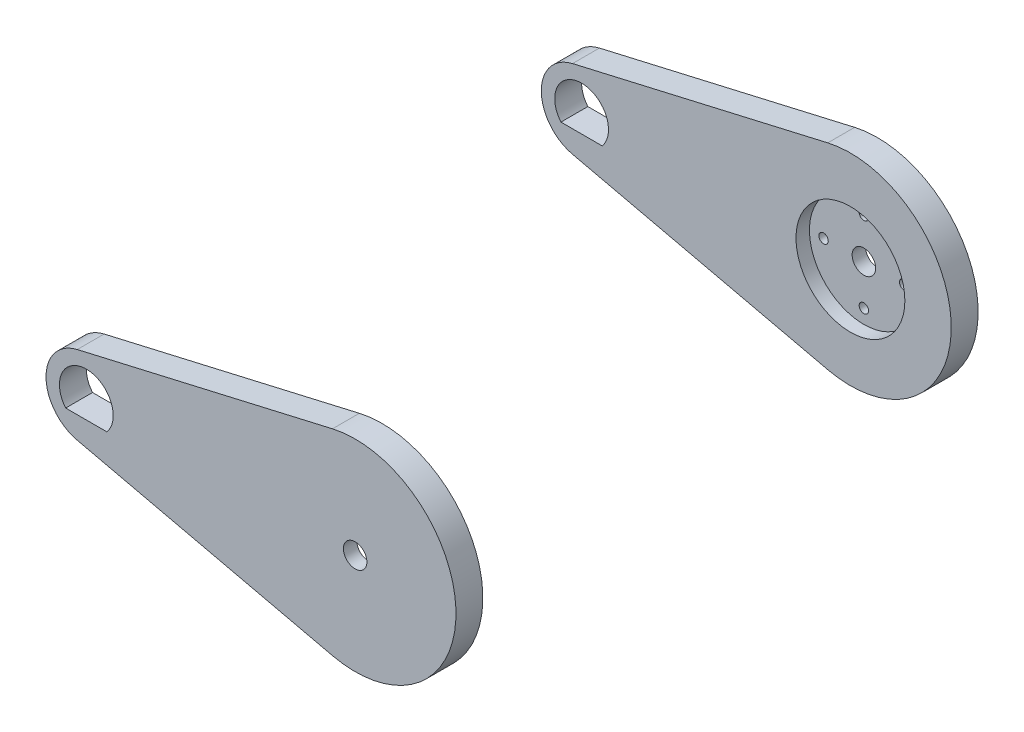
ISO-10303-21;
HEADER;
FILE_DESCRIPTION(('STEP AP214'),'2;1');
FILE_NAME('part.step','',(''),(''),'','','');
FILE_SCHEMA(('AUTOMOTIVE_DESIGN { 1 0 10303 214 1 1 1 1 }'));
ENDSEC;
DATA;
#1=APPLICATION_CONTEXT('core data for automotive mechanical design processes');
#2=APPLICATION_PROTOCOL_DEFINITION('international standard','automotive_design',2000,#1);
#3=PRODUCT_CONTEXT('',#1,'mechanical');
#4=PRODUCT('Part','Part','',(#3));
#5=PRODUCT_RELATED_PRODUCT_CATEGORY('part','',(#4));
#6=PRODUCT_DEFINITION_FORMATION('','',#4);
#7=PRODUCT_DEFINITION_CONTEXT('part definition',#1,'design');
#8=PRODUCT_DEFINITION('design','',#6,#7);
#9=PRODUCT_DEFINITION_SHAPE('','',#8);
#10=(LENGTH_UNIT() NAMED_UNIT(*) SI_UNIT(.MILLI.,.METRE.));
#11=(NAMED_UNIT(*) PLANE_ANGLE_UNIT() SI_UNIT($,.RADIAN.));
#12=(NAMED_UNIT(*) SI_UNIT($,.STERADIAN.) SOLID_ANGLE_UNIT());
#13=UNCERTAINTY_MEASURE_WITH_UNIT(LENGTH_MEASURE(1.E-05),#10,'distance_accuracy_value','');
#14=(GEOMETRIC_REPRESENTATION_CONTEXT(3) GLOBAL_UNCERTAINTY_ASSIGNED_CONTEXT((#13)) GLOBAL_UNIT_ASSIGNED_CONTEXT((#10,
#11,#12)) REPRESENTATION_CONTEXT('',''));
#15=CARTESIAN_POINT('',(0.,0.,0.));
#16=DIRECTION('',(0.,0.,1.));
#17=DIRECTION('',(1.,0.,0.));
#18=AXIS2_PLACEMENT_3D('',#15,#16,#17);
#19=CARTESIAN_POINT('',(0.,0.,73.6959896765683));
#20=DIRECTION('',(0.,0.,1.));
#21=DIRECTION('',(-1.,0.,0.));
#22=AXIS2_PLACEMENT_3D('',#19,#20,#21);
#23=CYLINDRICAL_SURFACE('',#22,15.);
#24=DIRECTION('',(0.,0.,1.));
#25=VECTOR('',#24,1.);
#26=CARTESIAN_POINT('',(-3.375,14.6153814524288,73.6959896765683));
#27=LINE('',#26,#25);
#28=CARTESIAN_POINT('',(-3.375,14.6153814524288,73.6959896765683));
#29=VERTEX_POINT('',#28);
#30=CARTESIAN_POINT('',(-3.375,14.6153814524288,77.6959896765683));
#31=VERTEX_POINT('',#30);
#32=EDGE_CURVE('E112',#29,#31,#27,.T.);
#33=ORIENTED_EDGE('',*,*,#32,.T.);
#34=CARTESIAN_POINT('',(0.,0.,77.6959896765683));
#35=DIRECTION('',(0.,0.,1.));
#36=DIRECTION('',(1.,0.,0.));
#37=AXIS2_PLACEMENT_3D('',#34,#35,#36);
#38=CIRCLE('',#37,15.);
#39=CARTESIAN_POINT('',(-3.375,-14.6153814524288,77.6959896765683));
#40=VERTEX_POINT('',#39);
#41=EDGE_CURVE('E153',#40,#31,#38,.T.);
#42=ORIENTED_EDGE('',*,*,#41,.F.);
#43=DIRECTION('',(0.,0.,1.));
#44=VECTOR('',#43,1.);
#45=CARTESIAN_POINT('',(-3.375,-14.6153814524288,73.6959896765683));
#46=LINE('',#45,#44);
#47=CARTESIAN_POINT('',(-3.375,-14.6153814524288,73.6959896765683));
#48=VERTEX_POINT('',#47);
#49=EDGE_CURVE('E131',#48,#40,#46,.T.);
#50=ORIENTED_EDGE('',*,*,#49,.F.);
#51=CARTESIAN_POINT('',(0.,0.,73.6959896765683));
#52=DIRECTION('',(0.,0.,1.));
#53=DIRECTION('',(1.,0.,0.));
#54=AXIS2_PLACEMENT_3D('',#51,#52,#53);
#55=CIRCLE('',#54,15.);
#56=EDGE_CURVE('E58',#48,#29,#55,.T.);
#57=ORIENTED_EDGE('',*,*,#56,.T.);
#58=EDGE_LOOP('',(#33,#42,#50,#57));
#59=FACE_BOUND('',#58,.T.);
#60=ADVANCED_FACE('F50',(#59),#23,.T.);
#61=CARTESIAN_POINT('',(0.,0.,73.6959896765683));
#62=DIRECTION('',(0.,0.,1.));
#63=DIRECTION('',(-1.,0.,0.));
#64=AXIS2_PLACEMENT_3D('',#61,#62,#63);
#65=CYLINDRICAL_SURFACE('',#64,8.1);
#66=CARTESIAN_POINT('',(0.,0.,75.6959896765683));
#67=DIRECTION('',(0.,0.,1.));
#68=DIRECTION('',(1.,0.,0.));
#69=AXIS2_PLACEMENT_3D('',#66,#67,#68);
#70=CIRCLE('',#69,8.1);
#71=CARTESIAN_POINT('',(8.1,0.,75.6959896765683));
#72=VERTEX_POINT('',#71);
#73=EDGE_CURVE('E12',#72,#72,#70,.T.);
#74=ORIENTED_EDGE('',*,*,#73,.T.);
#75=EDGE_LOOP('',(#74));
#76=FACE_BOUND('',#75,.T.);
#77=CARTESIAN_POINT('',(0.,0.,73.6959896765683));
#78=DIRECTION('',(0.,0.,1.));
#79=DIRECTION('',(1.,0.,0.));
#80=AXIS2_PLACEMENT_3D('',#77,#78,#79);
#81=CIRCLE('',#80,8.1);
#82=CARTESIAN_POINT('',(8.1,0.,73.6959896765683));
#83=VERTEX_POINT('',#82);
#84=EDGE_CURVE('E156',#83,#83,#81,.T.);
#85=ORIENTED_EDGE('',*,*,#84,.F.);
#86=EDGE_LOOP('',(#85));
#87=FACE_BOUND('',#86,.T.);
#88=ADVANCED_FACE('F52',(#76,#87),#65,.F.);
#89=CARTESIAN_POINT('',(0.,0.,73.6959896765683));
#90=DIRECTION('',(0.,0.,-1.));
#91=DIRECTION('',(1.,0.,0.));
#92=AXIS2_PLACEMENT_3D('',#89,#90,#91);
#93=PLANE('',#92);
#94=ORIENTED_EDGE('',*,*,#84,.T.);
#95=EDGE_LOOP('',(#94));
#96=FACE_BOUND('',#95,.T.);
#97=ORIENTED_EDGE('',*,*,#56,.F.);
#98=DIRECTION('',(0.974358763495254,-0.225,0.));
#99=VECTOR('',#98,1.);
#100=CARTESIAN_POINT('',(-3.375,-14.6153814524288,73.6959896765683));
#101=LINE('',#100,#99);
#102=CARTESIAN_POINT('',(-41.35,-5.84615258097153,73.6959896765683));
#103=VERTEX_POINT('',#102);
#104=EDGE_CURVE('E65',#103,#48,#101,.T.);
#105=ORIENTED_EDGE('',*,*,#104,.F.);
#106=CARTESIAN_POINT('',(-40.,0.,73.6959896765683));
#107=DIRECTION('',(0.,0.,1.));
#108=DIRECTION('',(1.,0.,0.));
#109=AXIS2_PLACEMENT_3D('',#106,#107,#108);
#110=CIRCLE('',#109,6.);
#111=CARTESIAN_POINT('',(-41.35,5.84615258097153,73.6959896765683));
#112=VERTEX_POINT('',#111);
#113=EDGE_CURVE('E107',#112,#103,#110,.T.);
#114=ORIENTED_EDGE('',*,*,#113,.F.);
#115=DIRECTION('',(0.974358763495254,0.225,0.));
#116=VECTOR('',#115,1.);
#117=CARTESIAN_POINT('',(-3.375,14.6153814524288,73.6959896765683));
#118=LINE('',#117,#116);
#119=EDGE_CURVE('E72',#112,#29,#118,.T.);
#120=ORIENTED_EDGE('',*,*,#119,.T.);
#121=EDGE_LOOP('',(#97,#105,#114,#120));
#122=FACE_BOUND('',#121,.T.);
#123=CARTESIAN_POINT('',(-40.,0.,73.6959896765683));
#124=DIRECTION('',(0.,0.,1.));
#125=DIRECTION('',(1.,0.,0.));
#126=AXIS2_PLACEMENT_3D('',#123,#124,#125);
#127=CIRCLE('',#126,4.);
#128=CARTESIAN_POINT('',(-36.925,-2.55819760769179,73.6959896765683));
#129=VERTEX_POINT('',#128);
#130=CARTESIAN_POINT('',(-43.075,-2.55819760769179,73.6959896765683));
#131=VERTEX_POINT('',#130);
#132=EDGE_CURVE('E123',#129,#131,#127,.T.);
#133=ORIENTED_EDGE('',*,*,#132,.T.);
#134=DIRECTION('',(1.,0.,0.));
#135=VECTOR('',#134,1.);
#136=CARTESIAN_POINT('',(0.,-2.55819760769179,73.6959896765683));
#137=LINE('',#136,#135);
#138=EDGE_CURVE('E128',#131,#129,#137,.T.);
#139=ORIENTED_EDGE('',*,*,#138,.T.);
#140=EDGE_LOOP('',(#133,#139));
#141=FACE_BOUND('',#140,.T.);
#142=ADVANCED_FACE('F120',(#96,#122,#141),#93,.T.);
#143=CARTESIAN_POINT('',(0.,0.,77.6959896765683));
#144=DIRECTION('',(0.,0.,-1.));
#145=DIRECTION('',(1.,0.,0.));
#146=AXIS2_PLACEMENT_3D('',#143,#144,#145);
#147=PLANE('',#146);
#148=ORIENTED_EDGE('',*,*,#41,.T.);
#149=DIRECTION('',(0.974358763495254,0.225,0.));
#150=VECTOR('',#149,1.);
#151=CARTESIAN_POINT('',(-3.375,14.6153814524288,77.6959896765683));
#152=LINE('',#151,#150);
#153=CARTESIAN_POINT('',(-41.35,5.84615258097153,77.6959896765683));
#154=VERTEX_POINT('',#153);
#155=EDGE_CURVE('E132',#154,#31,#152,.T.);
#156=ORIENTED_EDGE('',*,*,#155,.F.);
#157=CARTESIAN_POINT('',(-40.,0.,77.6959896765683));
#158=DIRECTION('',(0.,0.,1.));
#159=DIRECTION('',(1.,0.,0.));
#160=AXIS2_PLACEMENT_3D('',#157,#158,#159);
#161=CIRCLE('',#160,6.);
#162=CARTESIAN_POINT('',(-41.35,-5.84615258097153,77.6959896765683));
#163=VERTEX_POINT('',#162);
#164=EDGE_CURVE('E109',#154,#163,#161,.T.);
#165=ORIENTED_EDGE('',*,*,#164,.T.);
#166=DIRECTION('',(0.974358763495254,-0.225,0.));
#167=VECTOR('',#166,1.);
#168=CARTESIAN_POINT('',(-3.375,-14.6153814524288,77.6959896765683));
#169=LINE('',#168,#167);
#170=EDGE_CURVE('E135',#163,#40,#169,.T.);
#171=ORIENTED_EDGE('',*,*,#170,.T.);
#172=EDGE_LOOP('',(#148,#156,#165,#171));
#173=FACE_BOUND('',#172,.T.);
#174=CARTESIAN_POINT('',(0.,0.,77.6959896765683));
#175=DIRECTION('',(0.,0.,1.));
#176=DIRECTION('',(1.,0.,0.));
#177=AXIS2_PLACEMENT_3D('',#174,#175,#176);
#178=CIRCLE('',#177,1.75);
#179=CARTESIAN_POINT('',(1.75,0.,77.6959896765683));
#180=VERTEX_POINT('',#179);
#181=EDGE_CURVE('E146',#180,#180,#178,.T.);
#182=ORIENTED_EDGE('',*,*,#181,.F.);
#183=EDGE_LOOP('',(#182));
#184=FACE_BOUND('',#183,.T.);
#185=CARTESIAN_POINT('',(-40.,0.,77.6959896765683));
#186=DIRECTION('',(0.,0.,1.));
#187=DIRECTION('',(1.,0.,0.));
#188=AXIS2_PLACEMENT_3D('',#185,#186,#187);
#189=CIRCLE('',#188,4.);
#190=CARTESIAN_POINT('',(-36.925,-2.55819760769179,77.6959896765683));
#191=VERTEX_POINT('',#190);
#192=CARTESIAN_POINT('',(-43.075,-2.55819760769179,77.6959896765683));
#193=VERTEX_POINT('',#192);
#194=EDGE_CURVE('E137',#191,#193,#189,.T.);
#195=ORIENTED_EDGE('',*,*,#194,.F.);
#196=DIRECTION('',(1.,0.,0.));
#197=VECTOR('',#196,1.);
#198=CARTESIAN_POINT('',(0.,-2.55819760769179,77.6959896765683));
#199=LINE('',#198,#197);
#200=EDGE_CURVE('E118',#193,#191,#199,.T.);
#201=ORIENTED_EDGE('',*,*,#200,.F.);
#202=EDGE_LOOP('',(#195,#201));
#203=FACE_BOUND('',#202,.T.);
#204=ADVANCED_FACE('F162',(#173,#184,#203),#147,.F.);
#205=CARTESIAN_POINT('',(0.,0.,75.6959896765683));
#206=DIRECTION('',(0.,0.,1.));
#207=DIRECTION('',(-1.,0.,0.));
#208=AXIS2_PLACEMENT_3D('',#205,#206,#207);
#209=CYLINDRICAL_SURFACE('',#208,1.75);
#210=CARTESIAN_POINT('',(0.,0.,75.6959896765683));
#211=DIRECTION('',(0.,0.,1.));
#212=DIRECTION('',(1.,0.,0.));
#213=AXIS2_PLACEMENT_3D('',#210,#211,#212);
#214=CIRCLE('',#213,1.75);
#215=CARTESIAN_POINT('',(1.75,0.,75.6959896765683));
#216=VERTEX_POINT('',#215);
#217=EDGE_CURVE('E150',#216,#216,#214,.T.);
#218=ORIENTED_EDGE('',*,*,#217,.F.);
#219=EDGE_LOOP('',(#218));
#220=FACE_BOUND('',#219,.T.);
#221=ORIENTED_EDGE('',*,*,#181,.T.);
#222=EDGE_LOOP('',(#221));
#223=FACE_BOUND('',#222,.T.);
#224=ADVANCED_FACE('F187',(#220,#223),#209,.F.);
#225=CARTESIAN_POINT('',(0.,0.,75.6959896765683));
#226=DIRECTION('',(0.,0.,-1.));
#227=DIRECTION('',(1.,0.,0.));
#228=AXIS2_PLACEMENT_3D('',#225,#226,#227);
#229=PLANE('',#228);
#230=ORIENTED_EDGE('',*,*,#217,.T.);
#231=EDGE_LOOP('',(#230));
#232=FACE_BOUND('',#231,.T.);
#233=ORIENTED_EDGE('',*,*,#73,.F.);
#234=EDGE_LOOP('',(#233));
#235=FACE_BOUND('',#234,.T.);
#236=ADVANCED_FACE('F193',(#232,#235),#229,.T.);
#237=CARTESIAN_POINT('',(-40.,0.,73.6959896765683));
#238=DIRECTION('',(0.,0.,1.));
#239=DIRECTION('',(-1.,0.,0.));
#240=AXIS2_PLACEMENT_3D('',#237,#238,#239);
#241=CYLINDRICAL_SURFACE('',#240,4.);
#242=ORIENTED_EDGE('',*,*,#194,.T.);
#243=DIRECTION('',(0.,0.,1.));
#244=VECTOR('',#243,1.);
#245=CARTESIAN_POINT('',(-43.075,-2.55819760769179,73.6959896765683));
#246=LINE('',#245,#244);
#247=EDGE_CURVE('E142',#131,#193,#246,.T.);
#248=ORIENTED_EDGE('',*,*,#247,.F.);
#249=ORIENTED_EDGE('',*,*,#132,.F.);
#250=DIRECTION('',(0.,0.,1.));
#251=VECTOR('',#250,1.);
#252=CARTESIAN_POINT('',(-36.925,-2.55819760769179,73.6959896765683));
#253=LINE('',#252,#251);
#254=EDGE_CURVE('E144',#129,#191,#253,.T.);
#255=ORIENTED_EDGE('',*,*,#254,.T.);
#256=EDGE_LOOP('',(#242,#248,#249,#255));
#257=FACE_BOUND('',#256,.T.);
#258=ADVANCED_FACE('F197',(#257),#241,.F.);
#259=CARTESIAN_POINT('',(-3.375,14.6153814524288,73.6959896765683));
#260=DIRECTION('',(-0.225,0.974358763495254,0.));
#261=DIRECTION('',(-0.974358763495254,-0.225,0.));
#262=AXIS2_PLACEMENT_3D('',#259,#260,#261);
#263=PLANE('',#262);
#264=ORIENTED_EDGE('',*,*,#155,.T.);
#265=ORIENTED_EDGE('',*,*,#32,.F.);
#266=ORIENTED_EDGE('',*,*,#119,.F.);
#267=DIRECTION('',(0.,0.,1.));
#268=VECTOR('',#267,1.);
#269=CARTESIAN_POINT('',(-41.35,5.84615258097153,73.6959896765683));
#270=LINE('',#269,#268);
#271=EDGE_CURVE('E105',#112,#154,#270,.T.);
#272=ORIENTED_EDGE('',*,*,#271,.T.);
#273=EDGE_LOOP('',(#264,#265,#266,#272));
#274=FACE_BOUND('',#273,.T.);
#275=ADVANCED_FACE('F116',(#274),#263,.T.);
#276=CARTESIAN_POINT('',(-40.,0.,73.6959896765683));
#277=DIRECTION('',(0.,0.,1.));
#278=DIRECTION('',(-1.,0.,0.));
#279=AXIS2_PLACEMENT_3D('',#276,#277,#278);
#280=CYLINDRICAL_SURFACE('',#279,6.);
#281=ORIENTED_EDGE('',*,*,#164,.F.);
#282=ORIENTED_EDGE('',*,*,#271,.F.);
#283=ORIENTED_EDGE('',*,*,#113,.T.);
#284=DIRECTION('',(0.,0.,1.));
#285=VECTOR('',#284,1.);
#286=CARTESIAN_POINT('',(-41.35,-5.84615258097153,73.6959896765683));
#287=LINE('',#286,#285);
#288=EDGE_CURVE('E113',#103,#163,#287,.T.);
#289=ORIENTED_EDGE('',*,*,#288,.T.);
#290=EDGE_LOOP('',(#281,#282,#283,#289));
#291=FACE_BOUND('',#290,.T.);
#292=ADVANCED_FACE('F106',(#291),#280,.T.);
#293=CARTESIAN_POINT('',(-3.375,-14.6153814524288,73.6959896765683));
#294=DIRECTION('',(0.225,0.974358763495254,0.));
#295=DIRECTION('',(-0.974358763495254,0.225,0.));
#296=AXIS2_PLACEMENT_3D('',#293,#294,#295);
#297=PLANE('',#296);
#298=ORIENTED_EDGE('',*,*,#170,.F.);
#299=ORIENTED_EDGE('',*,*,#288,.F.);
#300=ORIENTED_EDGE('',*,*,#104,.T.);
#301=ORIENTED_EDGE('',*,*,#49,.T.);
#302=EDGE_LOOP('',(#298,#299,#300,#301));
#303=FACE_BOUND('',#302,.T.);
#304=ADVANCED_FACE('F167',(#303),#297,.F.);
#305=CARTESIAN_POINT('',(0.,-2.55819760769179,73.6959896765683));
#306=DIRECTION('',(0.,1.,0.));
#307=DIRECTION('',(0.,0.,-1.));
#308=AXIS2_PLACEMENT_3D('',#305,#306,#307);
#309=PLANE('',#308);
#310=ORIENTED_EDGE('',*,*,#200,.T.);
#311=ORIENTED_EDGE('',*,*,#254,.F.);
#312=ORIENTED_EDGE('',*,*,#138,.F.);
#313=ORIENTED_EDGE('',*,*,#247,.T.);
#314=EDGE_LOOP('',(#310,#311,#312,#313));
#315=FACE_BOUND('',#314,.T.);
#316=ADVANCED_FACE('F169',(#315),#309,.T.);
#317=CLOSED_SHELL('',(#60,#88,#142,#204,#224,#236,#258,#275,#292,#304,#316));
#318=MANIFOLD_SOLID_BREP('B2_NOT_SHOWN',#317);
#319=CARTESIAN_POINT('',(0.,0.,4.));
#320=DIRECTION('',(0.,0.,-1.));
#321=DIRECTION('',(-1.,0.,0.));
#322=AXIS2_PLACEMENT_3D('',#319,#320,#321);
#323=CYLINDRICAL_SURFACE('',#322,15.);
#324=DIRECTION('',(0.,0.,-1.));
#325=VECTOR('',#324,1.);
#326=CARTESIAN_POINT('',(-3.375,14.6153814524288,4.));
#327=LINE('',#326,#325);
#328=CARTESIAN_POINT('',(-3.375,14.6153814524288,4.));
#329=VERTEX_POINT('',#328);
#330=CARTESIAN_POINT('',(-3.375,14.6153814524288,0.));
#331=VERTEX_POINT('',#330);
#332=EDGE_CURVE('E338',#329,#331,#327,.T.);
#333=ORIENTED_EDGE('',*,*,#332,.F.);
#334=CARTESIAN_POINT('',(0.,0.,4.));
#335=DIRECTION('',(0.,0.,1.));
#336=DIRECTION('',(1.,0.,0.));
#337=AXIS2_PLACEMENT_3D('',#334,#335,#336);
#338=CIRCLE('',#337,15.);
#339=CARTESIAN_POINT('',(-3.375,-14.6153814524288,4.));
#340=VERTEX_POINT('',#339);
#341=EDGE_CURVE('E325',#340,#329,#338,.T.);
#342=ORIENTED_EDGE('',*,*,#341,.F.);
#343=DIRECTION('',(0.,0.,-1.));
#344=VECTOR('',#343,1.);
#345=CARTESIAN_POINT('',(-3.375,-14.6153814524288,4.));
#346=LINE('',#345,#344);
#347=CARTESIAN_POINT('',(-3.375,-14.6153814524288,0.));
#348=VERTEX_POINT('',#347);
#349=EDGE_CURVE('E410',#340,#348,#346,.T.);
#350=ORIENTED_EDGE('',*,*,#349,.T.);
#351=CARTESIAN_POINT('',(0.,0.,0.));
#352=DIRECTION('',(0.,0.,1.));
#353=DIRECTION('',(1.,0.,0.));
#354=AXIS2_PLACEMENT_3D('',#351,#352,#353);
#355=CIRCLE('',#354,15.);
#356=EDGE_CURVE('E432',#348,#331,#355,.T.);
#357=ORIENTED_EDGE('',*,*,#356,.T.);
#358=EDGE_LOOP('',(#333,#342,#350,#357));
#359=FACE_BOUND('',#358,.T.);
#360=ADVANCED_FACE('F317',(#359),#323,.T.);
#361=CARTESIAN_POINT('',(0.,0.,4.));
#362=DIRECTION('',(0.,0.,-1.));
#363=DIRECTION('',(-1.,0.,0.));
#364=AXIS2_PLACEMENT_3D('',#361,#362,#363);
#365=CYLINDRICAL_SURFACE('',#364,8.1);
#366=CARTESIAN_POINT('',(0.,0.,2.));
#367=DIRECTION('',(0.,0.,1.));
#368=DIRECTION('',(1.,0.,0.));
#369=AXIS2_PLACEMENT_3D('',#366,#367,#368);
#370=CIRCLE('',#369,8.1);
#371=CARTESIAN_POINT('',(8.1,0.,2.));
#372=VERTEX_POINT('',#371);
#373=EDGE_CURVE('E48',#372,#372,#370,.T.);
#374=ORIENTED_EDGE('',*,*,#373,.F.);
#375=EDGE_LOOP('',(#374));
#376=FACE_BOUND('',#375,.T.);
#377=CARTESIAN_POINT('',(0.,0.,4.));
#378=DIRECTION('',(0.,0.,1.));
#379=DIRECTION('',(1.,0.,0.));
#380=AXIS2_PLACEMENT_3D('',#377,#378,#379);
#381=CIRCLE('',#380,8.1);
#382=CARTESIAN_POINT('',(8.1,0.,4.));
#383=VERTEX_POINT('',#382);
#384=EDGE_CURVE('E435',#383,#383,#381,.T.);
#385=ORIENTED_EDGE('',*,*,#384,.T.);
#386=EDGE_LOOP('',(#385));
#387=FACE_BOUND('',#386,.T.);
#388=ADVANCED_FACE('F319',(#376,#387),#365,.F.);
#389=CARTESIAN_POINT('',(0.,0.,4.));
#390=DIRECTION('',(0.,0.,1.));
#391=DIRECTION('',(1.,0.,0.));
#392=AXIS2_PLACEMENT_3D('',#389,#390,#391);
#393=PLANE('',#392);
#394=ORIENTED_EDGE('',*,*,#384,.F.);
#395=EDGE_LOOP('',(#394));
#396=FACE_BOUND('',#395,.T.);
#397=ORIENTED_EDGE('',*,*,#341,.T.);
#398=DIRECTION('',(0.974358763495254,0.225,0.));
#399=VECTOR('',#398,1.);
#400=CARTESIAN_POINT('',(-3.375,14.6153814524288,4.));
#401=LINE('',#400,#399);
#402=CARTESIAN_POINT('',(-41.35,5.84615258097153,4.));
#403=VERTEX_POINT('',#402);
#404=EDGE_CURVE('E374',#403,#329,#401,.T.);
#405=ORIENTED_EDGE('',*,*,#404,.F.);
#406=CARTESIAN_POINT('',(-40.,0.,4.));
#407=DIRECTION('',(0.,0.,1.));
#408=DIRECTION('',(1.,0.,0.));
#409=AXIS2_PLACEMENT_3D('',#406,#407,#408);
#410=CIRCLE('',#409,6.);
#411=CARTESIAN_POINT('',(-41.35,-5.84615258097153,4.));
#412=VERTEX_POINT('',#411);
#413=EDGE_CURVE('E382',#403,#412,#410,.T.);
#414=ORIENTED_EDGE('',*,*,#413,.T.);
#415=DIRECTION('',(0.974358763495254,-0.225,0.));
#416=VECTOR('',#415,1.);
#417=CARTESIAN_POINT('',(-3.375,-14.6153814524288,4.));
#418=LINE('',#417,#416);
#419=EDGE_CURVE('E387',#412,#340,#418,.T.);
#420=ORIENTED_EDGE('',*,*,#419,.T.);
#421=EDGE_LOOP('',(#397,#405,#414,#420));
#422=FACE_BOUND('',#421,.T.);
#423=CARTESIAN_POINT('',(-40.,0.,4.));
#424=DIRECTION('',(0.,0.,1.));
#425=DIRECTION('',(1.,0.,0.));
#426=AXIS2_PLACEMENT_3D('',#423,#424,#425);
#427=CIRCLE('',#426,4.);
#428=CARTESIAN_POINT('',(-36.925,-2.55819760769179,4.));
#429=VERTEX_POINT('',#428);
#430=CARTESIAN_POINT('',(-43.075,-2.55819760769179,4.));
#431=VERTEX_POINT('',#430);
#432=EDGE_CURVE('E404',#429,#431,#427,.T.);
#433=ORIENTED_EDGE('',*,*,#432,.F.);
#434=DIRECTION('',(1.,0.,0.));
#435=VECTOR('',#434,1.);
#436=CARTESIAN_POINT('',(0.,-2.55819760769179,4.));
#437=LINE('',#436,#435);
#438=EDGE_CURVE('E407',#431,#429,#437,.T.);
#439=ORIENTED_EDGE('',*,*,#438,.F.);
#440=EDGE_LOOP('',(#433,#439));
#441=FACE_BOUND('',#440,.T.);
#442=ADVANCED_FACE('F389',(#396,#422,#441),#393,.T.);
#443=CARTESIAN_POINT('',(0.,0.,0.));
#444=DIRECTION('',(0.,0.,1.));
#445=DIRECTION('',(1.,0.,0.));
#446=AXIS2_PLACEMENT_3D('',#443,#444,#445);
#447=PLANE('',#446);
#448=CARTESIAN_POINT('',(0.,6.,0.));
#449=DIRECTION('',(0.,0.,1.));
#450=DIRECTION('',(1.,0.,0.));
#451=AXIS2_PLACEMENT_3D('',#448,#449,#450);
#452=CIRCLE('',#451,0.7);
#453=CARTESIAN_POINT('',(0.7,6.,0.));
#454=VERTEX_POINT('',#453);
#455=EDGE_CURVE('E400',#454,#454,#452,.T.);
#456=ORIENTED_EDGE('',*,*,#455,.T.);
#457=EDGE_LOOP('',(#456));
#458=FACE_BOUND('',#457,.T.);
#459=CARTESIAN_POINT('',(6.,0.,0.));
#460=DIRECTION('',(0.,0.,1.));
#461=DIRECTION('',(1.,0.,0.));
#462=AXIS2_PLACEMENT_3D('',#459,#460,#461);
#463=CIRCLE('',#462,0.7);
#464=CARTESIAN_POINT('',(6.7,0.,0.));
#465=VERTEX_POINT('',#464);
#466=EDGE_CURVE('E509',#465,#465,#463,.T.);
#467=ORIENTED_EDGE('',*,*,#466,.T.);
#468=EDGE_LOOP('',(#467));
#469=FACE_BOUND('',#468,.T.);
#470=CARTESIAN_POINT('',(0.,-6.,0.));
#471=DIRECTION('',(0.,0.,1.));
#472=DIRECTION('',(1.,0.,0.));
#473=AXIS2_PLACEMENT_3D('',#470,#471,#472);
#474=CIRCLE('',#473,0.7);
#475=CARTESIAN_POINT('',(0.7,-6.,0.));
#476=VERTEX_POINT('',#475);
#477=EDGE_CURVE('E511',#476,#476,#474,.T.);
#478=ORIENTED_EDGE('',*,*,#477,.T.);
#479=EDGE_LOOP('',(#478));
#480=FACE_BOUND('',#479,.T.);
#481=CARTESIAN_POINT('',(-6.,0.,0.));
#482=DIRECTION('',(0.,0.,1.));
#483=DIRECTION('',(1.,0.,0.));
#484=AXIS2_PLACEMENT_3D('',#481,#482,#483);
#485=CIRCLE('',#484,0.7);
#486=CARTESIAN_POINT('',(-5.3,0.,0.));
#487=VERTEX_POINT('',#486);
#488=EDGE_CURVE('E515',#487,#487,#485,.T.);
#489=ORIENTED_EDGE('',*,*,#488,.T.);
#490=EDGE_LOOP('',(#489));
#491=FACE_BOUND('',#490,.T.);
#492=ORIENTED_EDGE('',*,*,#356,.F.);
#493=DIRECTION('',(0.974358763495254,-0.225,0.));
#494=VECTOR('',#493,1.);
#495=CARTESIAN_POINT('',(-3.375,-14.6153814524288,0.));
#496=LINE('',#495,#494);
#497=CARTESIAN_POINT('',(-41.35,-5.84615258097153,0.));
#498=VERTEX_POINT('',#497);
#499=EDGE_CURVE('E415',#498,#348,#496,.T.);
#500=ORIENTED_EDGE('',*,*,#499,.F.);
#501=CARTESIAN_POINT('',(-40.,0.,0.));
#502=DIRECTION('',(0.,0.,1.));
#503=DIRECTION('',(1.,0.,0.));
#504=AXIS2_PLACEMENT_3D('',#501,#502,#503);
#505=CIRCLE('',#504,6.);
#506=CARTESIAN_POINT('',(-41.35,5.84615258097153,0.));
#507=VERTEX_POINT('',#506);
#508=EDGE_CURVE('E413',#507,#498,#505,.T.);
#509=ORIENTED_EDGE('',*,*,#508,.F.);
#510=DIRECTION('',(0.974358763495254,0.225,0.));
#511=VECTOR('',#510,1.);
#512=CARTESIAN_POINT('',(-3.375,14.6153814524288,0.));
#513=LINE('',#512,#511);
#514=EDGE_CURVE('E376',#507,#331,#513,.T.);
#515=ORIENTED_EDGE('',*,*,#514,.T.);
#516=EDGE_LOOP('',(#492,#500,#509,#515));
#517=FACE_BOUND('',#516,.T.);
#518=CARTESIAN_POINT('',(0.,0.,0.));
#519=DIRECTION('',(0.,0.,1.));
#520=DIRECTION('',(1.,0.,0.));
#521=AXIS2_PLACEMENT_3D('',#518,#519,#520);
#522=CIRCLE('',#521,1.75);
#523=CARTESIAN_POINT('',(1.75,0.,0.));
#524=VERTEX_POINT('',#523);
#525=EDGE_CURVE('E424',#524,#524,#522,.T.);
#526=ORIENTED_EDGE('',*,*,#525,.T.);
#527=EDGE_LOOP('',(#526));
#528=FACE_BOUND('',#527,.T.);
#529=CARTESIAN_POINT('',(-40.,0.,0.));
#530=DIRECTION('',(0.,0.,1.));
#531=DIRECTION('',(1.,0.,0.));
#532=AXIS2_PLACEMENT_3D('',#529,#530,#531);
#533=CIRCLE('',#532,4.);
#534=CARTESIAN_POINT('',(-36.925,-2.55819760769179,0.));
#535=VERTEX_POINT('',#534);
#536=CARTESIAN_POINT('',(-43.075,-2.55819760769179,0.));
#537=VERTEX_POINT('',#536);
#538=EDGE_CURVE('E397',#535,#537,#533,.T.);
#539=ORIENTED_EDGE('',*,*,#538,.T.);
#540=DIRECTION('',(1.,0.,0.));
#541=VECTOR('',#540,1.);
#542=CARTESIAN_POINT('',(0.,-2.55819760769179,0.));
#543=LINE('',#542,#541);
#544=EDGE_CURVE('E392',#537,#535,#543,.T.);
#545=ORIENTED_EDGE('',*,*,#544,.T.);
#546=EDGE_LOOP('',(#539,#545));
#547=FACE_BOUND('',#546,.T.);
#548=ADVANCED_FACE('F441',(#458,#469,#480,#491,#517,#528,#547),#447,.F.);
#549=CARTESIAN_POINT('',(0.,0.,2.));
#550=DIRECTION('',(0.,0.,-1.));
#551=DIRECTION('',(-1.,0.,0.));
#552=AXIS2_PLACEMENT_3D('',#549,#550,#551);
#553=CYLINDRICAL_SURFACE('',#552,1.75);
#554=CARTESIAN_POINT('',(0.,0.,2.));
#555=DIRECTION('',(0.,0.,1.));
#556=DIRECTION('',(1.,0.,0.));
#557=AXIS2_PLACEMENT_3D('',#554,#555,#556);
#558=CIRCLE('',#557,1.75);
#559=CARTESIAN_POINT('',(1.75,0.,2.));
#560=VERTEX_POINT('',#559);
#561=EDGE_CURVE('E429',#560,#560,#558,.T.);
#562=ORIENTED_EDGE('',*,*,#561,.T.);
#563=EDGE_LOOP('',(#562));
#564=FACE_BOUND('',#563,.T.);
#565=ORIENTED_EDGE('',*,*,#525,.F.);
#566=EDGE_LOOP('',(#565));
#567=FACE_BOUND('',#566,.T.);
#568=ADVANCED_FACE('F465',(#564,#567),#553,.F.);
#569=CARTESIAN_POINT('',(0.,0.,2.));
#570=DIRECTION('',(0.,0.,1.));
#571=DIRECTION('',(1.,0.,0.));
#572=AXIS2_PLACEMENT_3D('',#569,#570,#571);
#573=PLANE('',#572);
#574=CARTESIAN_POINT('',(0.,6.,2.));
#575=DIRECTION('',(0.,0.,1.));
#576=DIRECTION('',(1.,0.,0.));
#577=AXIS2_PLACEMENT_3D('',#574,#575,#576);
#578=CIRCLE('',#577,0.7);
#579=CARTESIAN_POINT('',(0.7,6.,2.));
#580=VERTEX_POINT('',#579);
#581=EDGE_CURVE('E506',#580,#580,#578,.T.);
#582=ORIENTED_EDGE('',*,*,#581,.F.);
#583=EDGE_LOOP('',(#582));
#584=FACE_BOUND('',#583,.T.);
#585=CARTESIAN_POINT('',(6.,0.,2.));
#586=DIRECTION('',(0.,0.,1.));
#587=DIRECTION('',(1.,0.,0.));
#588=AXIS2_PLACEMENT_3D('',#585,#586,#587);
#589=CIRCLE('',#588,0.7);
#590=CARTESIAN_POINT('',(6.7,0.,2.));
#591=VERTEX_POINT('',#590);
#592=EDGE_CURVE('E526',#591,#591,#589,.T.);
#593=ORIENTED_EDGE('',*,*,#592,.F.);
#594=EDGE_LOOP('',(#593));
#595=FACE_BOUND('',#594,.T.);
#596=CARTESIAN_POINT('',(0.,-6.,2.));
#597=DIRECTION('',(0.,0.,1.));
#598=DIRECTION('',(1.,0.,0.));
#599=AXIS2_PLACEMENT_3D('',#596,#597,#598);
#600=CIRCLE('',#599,0.7);
#601=CARTESIAN_POINT('',(0.7,-6.,2.));
#602=VERTEX_POINT('',#601);
#603=EDGE_CURVE('E523',#602,#602,#600,.T.);
#604=ORIENTED_EDGE('',*,*,#603,.F.);
#605=EDGE_LOOP('',(#604));
#606=FACE_BOUND('',#605,.T.);
#607=CARTESIAN_POINT('',(-6.,0.,2.));
#608=DIRECTION('',(0.,0.,1.));
#609=DIRECTION('',(1.,0.,0.));
#610=AXIS2_PLACEMENT_3D('',#607,#608,#609);
#611=CIRCLE('',#610,0.7);
#612=CARTESIAN_POINT('',(-5.3,0.,2.));
#613=VERTEX_POINT('',#612);
#614=EDGE_CURVE('E520',#613,#613,#611,.T.);
#615=ORIENTED_EDGE('',*,*,#614,.F.);
#616=EDGE_LOOP('',(#615));
#617=FACE_BOUND('',#616,.T.);
#618=ORIENTED_EDGE('',*,*,#561,.F.);
#619=EDGE_LOOP('',(#618));
#620=FACE_BOUND('',#619,.T.);
#621=ORIENTED_EDGE('',*,*,#373,.T.);
#622=EDGE_LOOP('',(#621));
#623=FACE_BOUND('',#622,.T.);
#624=ADVANCED_FACE('F472',(#584,#595,#606,#617,#620,#623),#573,.T.);
#625=CARTESIAN_POINT('',(-40.,0.,4.));
#626=DIRECTION('',(0.,0.,-1.));
#627=DIRECTION('',(-1.,0.,0.));
#628=AXIS2_PLACEMENT_3D('',#625,#626,#627);
#629=CYLINDRICAL_SURFACE('',#628,4.);
#630=ORIENTED_EDGE('',*,*,#538,.F.);
#631=DIRECTION('',(0.,0.,-1.));
#632=VECTOR('',#631,1.);
#633=CARTESIAN_POINT('',(-36.925,-2.55819760769179,4.));
#634=LINE('',#633,#632);
#635=EDGE_CURVE('E422',#429,#535,#634,.T.);
#636=ORIENTED_EDGE('',*,*,#635,.F.);
#637=ORIENTED_EDGE('',*,*,#432,.T.);
#638=DIRECTION('',(0.,0.,-1.));
#639=VECTOR('',#638,1.);
#640=CARTESIAN_POINT('',(-43.075,-2.55819760769179,4.));
#641=LINE('',#640,#639);
#642=EDGE_CURVE('E420',#431,#537,#641,.T.);
#643=ORIENTED_EDGE('',*,*,#642,.T.);
#644=EDGE_LOOP('',(#630,#636,#637,#643));
#645=FACE_BOUND('',#644,.T.);
#646=ADVANCED_FACE('F476',(#645),#629,.F.);
#647=CARTESIAN_POINT('',(-3.375,14.6153814524288,4.));
#648=DIRECTION('',(-0.225,0.974358763495254,0.));
#649=DIRECTION('',(-0.974358763495254,-0.225,0.));
#650=AXIS2_PLACEMENT_3D('',#647,#648,#649);
#651=PLANE('',#650);
#652=ORIENTED_EDGE('',*,*,#514,.F.);
#653=DIRECTION('',(0.,0.,-1.));
#654=VECTOR('',#653,1.);
#655=CARTESIAN_POINT('',(-41.35,5.84615258097153,4.));
#656=LINE('',#655,#654);
#657=EDGE_CURVE('E370',#403,#507,#656,.T.);
#658=ORIENTED_EDGE('',*,*,#657,.F.);
#659=ORIENTED_EDGE('',*,*,#404,.T.);
#660=ORIENTED_EDGE('',*,*,#332,.T.);
#661=EDGE_LOOP('',(#652,#658,#659,#660));
#662=FACE_BOUND('',#661,.T.);
#663=ADVANCED_FACE('F372',(#662),#651,.T.);
#664=CARTESIAN_POINT('',(-40.,0.,4.));
#665=DIRECTION('',(0.,0.,-1.));
#666=DIRECTION('',(-1.,0.,0.));
#667=AXIS2_PLACEMENT_3D('',#664,#665,#666);
#668=CYLINDRICAL_SURFACE('',#667,6.);
#669=ORIENTED_EDGE('',*,*,#508,.T.);
#670=DIRECTION('',(0.,0.,-1.));
#671=VECTOR('',#670,1.);
#672=CARTESIAN_POINT('',(-41.35,-5.84615258097153,4.));
#673=LINE('',#672,#671);
#674=EDGE_CURVE('E379',#412,#498,#673,.T.);
#675=ORIENTED_EDGE('',*,*,#674,.F.);
#676=ORIENTED_EDGE('',*,*,#413,.F.);
#677=ORIENTED_EDGE('',*,*,#657,.T.);
#678=EDGE_LOOP('',(#669,#675,#676,#677));
#679=FACE_BOUND('',#678,.T.);
#680=ADVANCED_FACE('F383',(#679),#668,.T.);
#681=CARTESIAN_POINT('',(-3.375,-14.6153814524288,4.));
#682=DIRECTION('',(0.225,0.974358763495254,0.));
#683=DIRECTION('',(-0.974358763495254,0.225,0.));
#684=AXIS2_PLACEMENT_3D('',#681,#682,#683);
#685=PLANE('',#684);
#686=ORIENTED_EDGE('',*,*,#499,.T.);
#687=ORIENTED_EDGE('',*,*,#349,.F.);
#688=ORIENTED_EDGE('',*,*,#419,.F.);
#689=ORIENTED_EDGE('',*,*,#674,.T.);
#690=EDGE_LOOP('',(#686,#687,#688,#689));
#691=FACE_BOUND('',#690,.T.);
#692=ADVANCED_FACE('F444',(#691),#685,.F.);
#693=CARTESIAN_POINT('',(0.,-2.55819760769179,4.));
#694=DIRECTION('',(0.,1.,0.));
#695=DIRECTION('',(0.,0.,1.));
#696=AXIS2_PLACEMENT_3D('',#693,#694,#695);
#697=PLANE('',#696);
#698=ORIENTED_EDGE('',*,*,#544,.F.);
#699=ORIENTED_EDGE('',*,*,#642,.F.);
#700=ORIENTED_EDGE('',*,*,#438,.T.);
#701=ORIENTED_EDGE('',*,*,#635,.T.);
#702=EDGE_LOOP('',(#698,#699,#700,#701));
#703=FACE_BOUND('',#702,.T.);
#704=ADVANCED_FACE('F446',(#703),#697,.T.);
#705=CARTESIAN_POINT('',(-6.,0.,-8.));
#706=DIRECTION('',(0.,0.,1.));
#707=DIRECTION('',(1.,0.,0.));
#708=AXIS2_PLACEMENT_3D('',#705,#706,#707);
#709=CYLINDRICAL_SURFACE('',#708,0.7);
#710=ORIENTED_EDGE('',*,*,#614,.T.);
#711=EDGE_LOOP('',(#710));
#712=FACE_BOUND('',#711,.T.);
#713=ORIENTED_EDGE('',*,*,#488,.F.);
#714=EDGE_LOOP('',(#713));
#715=FACE_BOUND('',#714,.T.);
#716=ADVANCED_FACE('F452',(#712,#715),#709,.F.);
#717=CARTESIAN_POINT('',(0.,-6.,-8.));
#718=DIRECTION('',(0.,0.,1.));
#719=DIRECTION('',(1.,0.,0.));
#720=AXIS2_PLACEMENT_3D('',#717,#718,#719);
#721=CYLINDRICAL_SURFACE('',#720,0.7);
#722=ORIENTED_EDGE('',*,*,#603,.T.);
#723=EDGE_LOOP('',(#722));
#724=FACE_BOUND('',#723,.T.);
#725=ORIENTED_EDGE('',*,*,#477,.F.);
#726=EDGE_LOOP('',(#725));
#727=FACE_BOUND('',#726,.T.);
#728=ADVANCED_FACE('F489',(#724,#727),#721,.F.);
#729=CARTESIAN_POINT('',(6.,0.,-8.));
#730=DIRECTION('',(0.,0.,1.));
#731=DIRECTION('',(1.,0.,0.));
#732=AXIS2_PLACEMENT_3D('',#729,#730,#731);
#733=CYLINDRICAL_SURFACE('',#732,0.7);
#734=ORIENTED_EDGE('',*,*,#592,.T.);
#735=EDGE_LOOP('',(#734));
#736=FACE_BOUND('',#735,.T.);
#737=ORIENTED_EDGE('',*,*,#466,.F.);
#738=EDGE_LOOP('',(#737));
#739=FACE_BOUND('',#738,.T.);
#740=ADVANCED_FACE('F493',(#736,#739),#733,.F.);
#741=CARTESIAN_POINT('',(0.,6.,-8.));
#742=DIRECTION('',(0.,0.,1.));
#743=DIRECTION('',(1.,0.,0.));
#744=AXIS2_PLACEMENT_3D('',#741,#742,#743);
#745=CYLINDRICAL_SURFACE('',#744,0.7);
#746=ORIENTED_EDGE('',*,*,#581,.T.);
#747=EDGE_LOOP('',(#746));
#748=FACE_BOUND('',#747,.T.);
#749=ORIENTED_EDGE('',*,*,#455,.F.);
#750=EDGE_LOOP('',(#749));
#751=FACE_BOUND('',#750,.T.);
#752=ADVANCED_FACE('F497',(#748,#751),#745,.F.);
#753=CLOSED_SHELL('',(#360,#388,#442,#548,#568,#624,#646,#663,#680,#692,#704,#716,#728,#740,#752));
#754=MANIFOLD_SOLID_BREP('B6',#753);
#755=ADVANCED_BREP_SHAPE_REPRESENTATION('',(#18,#318,#754),#14);
#756=SHAPE_DEFINITION_REPRESENTATION(#9,#755);
ENDSEC;
END-ISO-10303-21;
